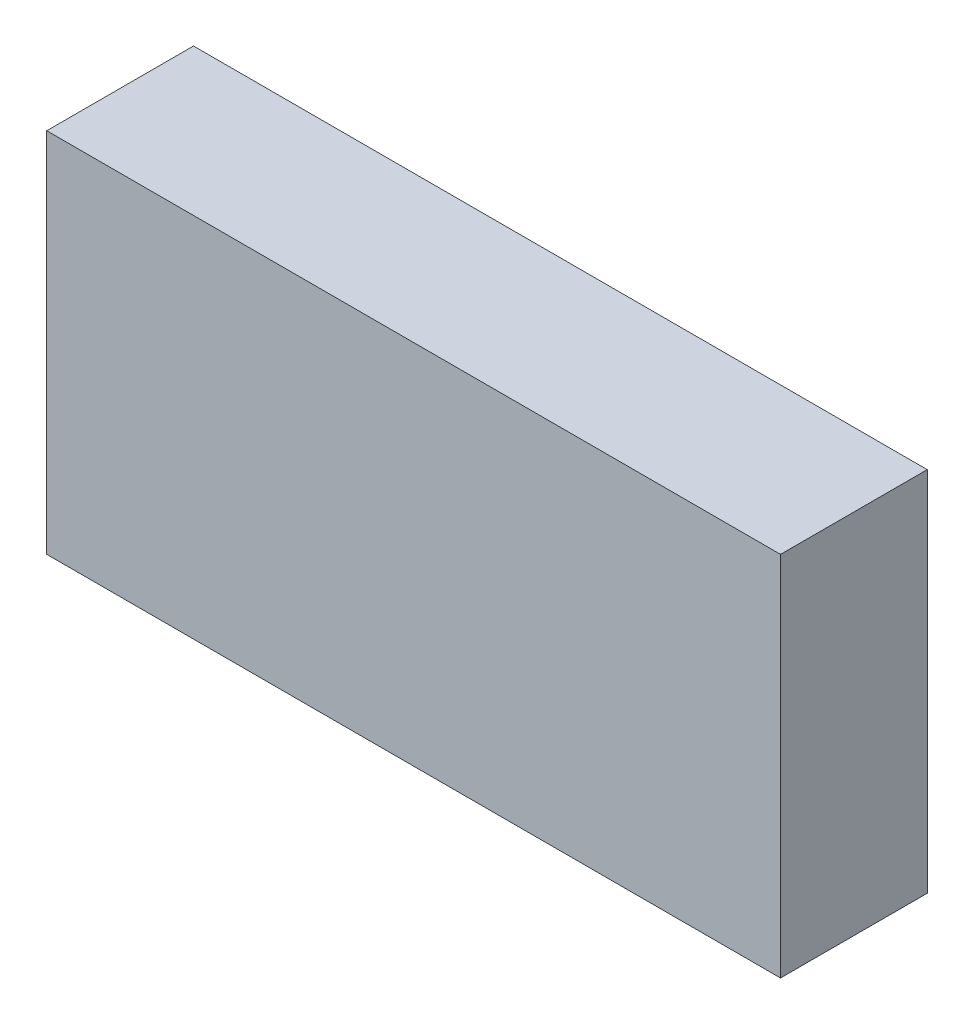
ISO-10303-21;
HEADER;
FILE_DESCRIPTION(('STEP AP214'),'2;1');
FILE_NAME('part.step','',(''),(''),'','','');
FILE_SCHEMA(('AUTOMOTIVE_DESIGN { 1 0 10303 214 1 1 1 1 }'));
ENDSEC;
DATA;
#1=APPLICATION_CONTEXT('core data for automotive mechanical design processes');
#2=APPLICATION_PROTOCOL_DEFINITION('international standard','automotive_design',2000,#1);
#3=PRODUCT_CONTEXT('',#1,'mechanical');
#4=PRODUCT('Part','Part','',(#3));
#5=PRODUCT_RELATED_PRODUCT_CATEGORY('part','',(#4));
#6=PRODUCT_DEFINITION_FORMATION('','',#4);
#7=PRODUCT_DEFINITION_CONTEXT('part definition',#1,'design');
#8=PRODUCT_DEFINITION('design','',#6,#7);
#9=PRODUCT_DEFINITION_SHAPE('','',#8);
#10=(LENGTH_UNIT() NAMED_UNIT(*) SI_UNIT(.MILLI.,.METRE.));
#11=(NAMED_UNIT(*) PLANE_ANGLE_UNIT() SI_UNIT($,.RADIAN.));
#12=(NAMED_UNIT(*) SI_UNIT($,.STERADIAN.) SOLID_ANGLE_UNIT());
#13=UNCERTAINTY_MEASURE_WITH_UNIT(LENGTH_MEASURE(1.E-05),#10,'distance_accuracy_value','');
#14=(GEOMETRIC_REPRESENTATION_CONTEXT(3) GLOBAL_UNCERTAINTY_ASSIGNED_CONTEXT((#13)) GLOBAL_UNIT_ASSIGNED_CONTEXT((#10,
#11,#12)) REPRESENTATION_CONTEXT('',''));
#15=CARTESIAN_POINT('',(0.,0.,0.));
#16=DIRECTION('',(0.,0.,1.));
#17=DIRECTION('',(1.,0.,0.));
#18=AXIS2_PLACEMENT_3D('',#15,#16,#17);
#19=CARTESIAN_POINT('',(25.,-12.5,10.));
#20=DIRECTION('',(-1.,0.,0.));
#21=DIRECTION('',(0.,0.,1.));
#22=AXIS2_PLACEMENT_3D('',#19,#20,#21);
#23=PLANE('',#22);
#24=DIRECTION('',(0.,1.,0.));
#25=VECTOR('',#24,1.);
#26=CARTESIAN_POINT('',(25.,-12.5,0.));
#27=LINE('',#26,#25);
#28=CARTESIAN_POINT('',(25.,-12.5,0.));
#29=VERTEX_POINT('',#28);
#30=CARTESIAN_POINT('',(25.,12.5,0.));
#31=VERTEX_POINT('',#30);
#32=EDGE_CURVE('E113',#29,#31,#27,.T.);
#33=ORIENTED_EDGE('',*,*,#32,.T.);
#34=DIRECTION('',(0.,0.,-1.));
#35=VECTOR('',#34,1.);
#36=CARTESIAN_POINT('',(25.,12.5,10.));
#37=LINE('',#36,#35);
#38=CARTESIAN_POINT('',(25.,12.5,10.));
#39=VERTEX_POINT('',#38);
#40=EDGE_CURVE('E11',#39,#31,#37,.T.);
#41=ORIENTED_EDGE('',*,*,#40,.F.);
#42=DIRECTION('',(0.,1.,0.));
#43=VECTOR('',#42,1.);
#44=CARTESIAN_POINT('',(25.,-12.5,10.));
#45=LINE('',#44,#43);
#46=CARTESIAN_POINT('',(25.,-12.5,10.));
#47=VERTEX_POINT('',#46);
#48=EDGE_CURVE('E97',#47,#39,#45,.T.);
#49=ORIENTED_EDGE('',*,*,#48,.F.);
#50=DIRECTION('',(0.,0.,-1.));
#51=VECTOR('',#50,1.);
#52=CARTESIAN_POINT('',(25.,-12.5,10.));
#53=LINE('',#52,#51);
#54=EDGE_CURVE('E109',#47,#29,#53,.T.);
#55=ORIENTED_EDGE('',*,*,#54,.T.);
#56=EDGE_LOOP('',(#33,#41,#49,#55));
#57=FACE_BOUND('',#56,.T.);
#58=ADVANCED_FACE('F45',(#57),#23,.F.);
#59=CARTESIAN_POINT('',(-25.,12.5,10.));
#60=DIRECTION('',(0.,-1.,0.));
#61=DIRECTION('',(0.,0.,-1.));
#62=AXIS2_PLACEMENT_3D('',#59,#60,#61);
#63=PLANE('',#62);
#64=DIRECTION('',(-1.,0.,0.));
#65=VECTOR('',#64,1.);
#66=CARTESIAN_POINT('',(-25.,12.5,0.));
#67=LINE('',#66,#65);
#68=CARTESIAN_POINT('',(-25.,12.5,0.));
#69=VERTEX_POINT('',#68);
#70=EDGE_CURVE('E102',#31,#69,#67,.T.);
#71=ORIENTED_EDGE('',*,*,#70,.T.);
#72=DIRECTION('',(0.,0.,-1.));
#73=VECTOR('',#72,1.);
#74=CARTESIAN_POINT('',(-25.,12.5,10.));
#75=LINE('',#74,#73);
#76=CARTESIAN_POINT('',(-25.,12.5,10.));
#77=VERTEX_POINT('',#76);
#78=EDGE_CURVE('E54',#77,#69,#75,.T.);
#79=ORIENTED_EDGE('',*,*,#78,.F.);
#80=DIRECTION('',(-1.,0.,0.));
#81=VECTOR('',#80,1.);
#82=CARTESIAN_POINT('',(-25.,12.5,10.));
#83=LINE('',#82,#81);
#84=EDGE_CURVE('E92',#39,#77,#83,.T.);
#85=ORIENTED_EDGE('',*,*,#84,.F.);
#86=ORIENTED_EDGE('',*,*,#40,.T.);
#87=EDGE_LOOP('',(#71,#79,#85,#86));
#88=FACE_BOUND('',#87,.T.);
#89=ADVANCED_FACE('F101',(#88),#63,.F.);
#90=CARTESIAN_POINT('',(-25.,-12.5,10.));
#91=DIRECTION('',(1.,0.,0.));
#92=DIRECTION('',(0.,0.,-1.));
#93=AXIS2_PLACEMENT_3D('',#90,#91,#92);
#94=PLANE('',#93);
#95=DIRECTION('',(0.,-1.,0.));
#96=VECTOR('',#95,1.);
#97=CARTESIAN_POINT('',(-25.,-12.5,0.));
#98=LINE('',#97,#96);
#99=CARTESIAN_POINT('',(-25.,-12.5,0.));
#100=VERTEX_POINT('',#99);
#101=EDGE_CURVE('E79',#69,#100,#98,.T.);
#102=ORIENTED_EDGE('',*,*,#101,.T.);
#103=DIRECTION('',(0.,0.,-1.));
#104=VECTOR('',#103,1.);
#105=CARTESIAN_POINT('',(-25.,-12.5,10.));
#106=LINE('',#105,#104);
#107=CARTESIAN_POINT('',(-25.,-12.5,10.));
#108=VERTEX_POINT('',#107);
#109=EDGE_CURVE('E104',#108,#100,#106,.T.);
#110=ORIENTED_EDGE('',*,*,#109,.F.);
#111=DIRECTION('',(0.,-1.,0.));
#112=VECTOR('',#111,1.);
#113=CARTESIAN_POINT('',(-25.,-12.5,10.));
#114=LINE('',#113,#112);
#115=EDGE_CURVE('E95',#77,#108,#114,.T.);
#116=ORIENTED_EDGE('',*,*,#115,.F.);
#117=ORIENTED_EDGE('',*,*,#78,.T.);
#118=EDGE_LOOP('',(#102,#110,#116,#117));
#119=FACE_BOUND('',#118,.T.);
#120=ADVANCED_FACE('F105',(#119),#94,.F.);
#121=CARTESIAN_POINT('',(-25.,-12.5,10.));
#122=DIRECTION('',(0.,1.,0.));
#123=DIRECTION('',(0.,0.,1.));
#124=AXIS2_PLACEMENT_3D('',#121,#122,#123);
#125=PLANE('',#124);
#126=DIRECTION('',(1.,0.,0.));
#127=VECTOR('',#126,1.);
#128=CARTESIAN_POINT('',(-25.,-12.5,0.));
#129=LINE('',#128,#127);
#130=EDGE_CURVE('E85',#100,#29,#129,.T.);
#131=ORIENTED_EDGE('',*,*,#130,.T.);
#132=ORIENTED_EDGE('',*,*,#54,.F.);
#133=DIRECTION('',(1.,0.,0.));
#134=VECTOR('',#133,1.);
#135=CARTESIAN_POINT('',(-25.,-12.5,10.));
#136=LINE('',#135,#134);
#137=EDGE_CURVE('E62',#108,#47,#136,.T.);
#138=ORIENTED_EDGE('',*,*,#137,.F.);
#139=ORIENTED_EDGE('',*,*,#109,.T.);
#140=EDGE_LOOP('',(#131,#132,#138,#139));
#141=FACE_BOUND('',#140,.T.);
#142=ADVANCED_FACE('F126',(#141),#125,.F.);
#143=CARTESIAN_POINT('',(0.,0.,10.));
#144=DIRECTION('',(0.,0.,-1.));
#145=DIRECTION('',(-1.,0.,0.));
#146=AXIS2_PLACEMENT_3D('',#143,#144,#145);
#147=PLANE('',#146);
#148=ORIENTED_EDGE('',*,*,#48,.T.);
#149=ORIENTED_EDGE('',*,*,#84,.T.);
#150=ORIENTED_EDGE('',*,*,#115,.T.);
#151=ORIENTED_EDGE('',*,*,#137,.T.);
#152=EDGE_LOOP('',(#148,#149,#150,#151));
#153=FACE_BOUND('',#152,.T.);
#154=ADVANCED_FACE('F93',(#153),#147,.F.);
#155=CARTESIAN_POINT('',(0.,0.,0.));
#156=DIRECTION('',(0.,0.,-1.));
#157=DIRECTION('',(-1.,0.,0.));
#158=AXIS2_PLACEMENT_3D('',#155,#156,#157);
#159=PLANE('',#158);
#160=ORIENTED_EDGE('',*,*,#32,.F.);
#161=ORIENTED_EDGE('',*,*,#130,.F.);
#162=ORIENTED_EDGE('',*,*,#101,.F.);
#163=ORIENTED_EDGE('',*,*,#70,.F.);
#164=EDGE_LOOP('',(#160,#161,#162,#163));
#165=FACE_BOUND('',#164,.T.);
#166=ADVANCED_FACE('F129',(#165),#159,.T.);
#167=CLOSED_SHELL('',(#58,#89,#120,#142,#154,#166));
#168=MANIFOLD_SOLID_BREP('B2',#167);
#169=ADVANCED_BREP_SHAPE_REPRESENTATION('',(#18,#168),#14);
#170=SHAPE_DEFINITION_REPRESENTATION(#9,#169);
ENDSEC;
END-ISO-10303-21;
